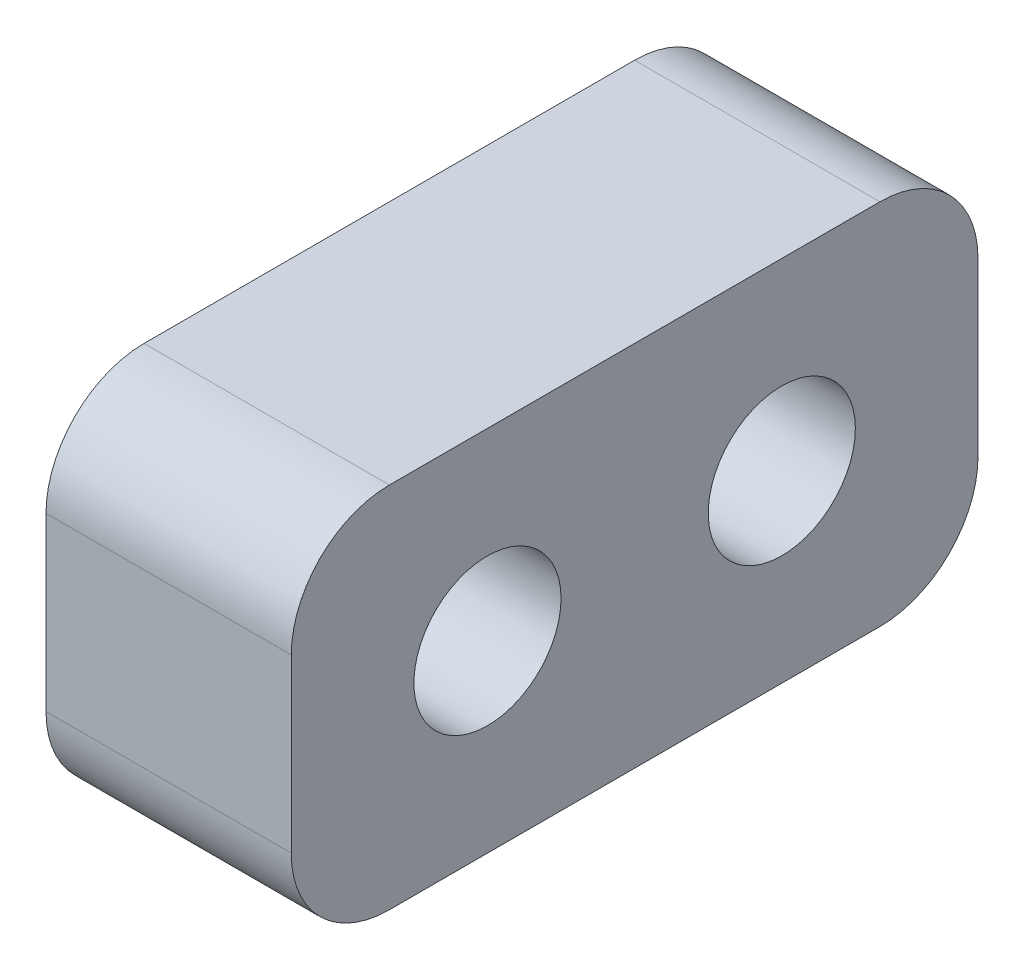
ISO-10303-21;
HEADER;
FILE_DESCRIPTION(('STEP AP214'),'2;1');
FILE_NAME('part.step','',(''),(''),'','','');
FILE_SCHEMA(('AUTOMOTIVE_DESIGN { 1 0 10303 214 1 1 1 1 }'));
ENDSEC;
DATA;
#1=APPLICATION_CONTEXT('core data for automotive mechanical design processes');
#2=APPLICATION_PROTOCOL_DEFINITION('international standard','automotive_design',2000,#1);
#3=PRODUCT_CONTEXT('',#1,'mechanical');
#4=PRODUCT('Part','Part','',(#3));
#5=PRODUCT_RELATED_PRODUCT_CATEGORY('part','',(#4));
#6=PRODUCT_DEFINITION_FORMATION('','',#4);
#7=PRODUCT_DEFINITION_CONTEXT('part definition',#1,'design');
#8=PRODUCT_DEFINITION('design','',#6,#7);
#9=PRODUCT_DEFINITION_SHAPE('','',#8);
#10=(LENGTH_UNIT() NAMED_UNIT(*) SI_UNIT(.MILLI.,.METRE.));
#11=(NAMED_UNIT(*) PLANE_ANGLE_UNIT() SI_UNIT($,.RADIAN.));
#12=(NAMED_UNIT(*) SI_UNIT($,.STERADIAN.) SOLID_ANGLE_UNIT());
#13=UNCERTAINTY_MEASURE_WITH_UNIT(LENGTH_MEASURE(1.E-05),#10,'distance_accuracy_value','');
#14=(GEOMETRIC_REPRESENTATION_CONTEXT(3) GLOBAL_UNCERTAINTY_ASSIGNED_CONTEXT((#13)) GLOBAL_UNIT_ASSIGNED_CONTEXT((#10,
#11,#12)) REPRESENTATION_CONTEXT('',''));
#15=CARTESIAN_POINT('',(0.,0.,0.));
#16=DIRECTION('',(0.,0.,1.));
#17=DIRECTION('',(1.,0.,0.));
#18=AXIS2_PLACEMENT_3D('',#15,#16,#17);
#19=CARTESIAN_POINT('',(5.,5.5,12.));
#20=DIRECTION('',(1.,0.,0.));
#21=DIRECTION('',(0.,0.,-1.));
#22=AXIS2_PLACEMENT_3D('',#19,#20,#21);
#23=PLANE('',#22);
#24=CARTESIAN_POINT('',(5.,3.75,10.));
#25=DIRECTION('',(1.,0.,0.));
#26=DIRECTION('',(0.,0.,-1.));
#27=AXIS2_PLACEMENT_3D('',#24,#25,#26);
#28=CIRCLE('',#27,1.5);
#29=CARTESIAN_POINT('',(5.,3.75,8.5));
#30=VERTEX_POINT('',#29);
#31=EDGE_CURVE('E140',#30,#30,#28,.T.);
#32=ORIENTED_EDGE('',*,*,#31,.F.);
#33=EDGE_LOOP('',(#32));
#34=FACE_BOUND('',#33,.T.);
#35=CARTESIAN_POINT('',(5.,5.5,12.));
#36=DIRECTION('',(1.,0.,0.));
#37=DIRECTION('',(0.,0.,-1.));
#38=AXIS2_PLACEMENT_3D('',#35,#36,#37);
#39=CIRCLE('',#38,2.);
#40=CARTESIAN_POINT('',(5.,7.5,12.));
#41=VERTEX_POINT('',#40);
#42=CARTESIAN_POINT('',(5.,5.5,14.));
#43=VERTEX_POINT('',#42);
#44=EDGE_CURVE('E151',#41,#43,#39,.T.);
#45=ORIENTED_EDGE('',*,*,#44,.T.);
#46=DIRECTION('',(0.,-1.,0.));
#47=VECTOR('',#46,1.);
#48=CARTESIAN_POINT('',(5.,2.,14.));
#49=LINE('',#48,#47);
#50=CARTESIAN_POINT('',(5.,2.,14.));
#51=VERTEX_POINT('',#50);
#52=EDGE_CURVE('E99',#43,#51,#49,.T.);
#53=ORIENTED_EDGE('',*,*,#52,.T.);
#54=CARTESIAN_POINT('',(5.,2.,12.));
#55=DIRECTION('',(1.,0.,0.));
#56=DIRECTION('',(0.,0.,1.));
#57=AXIS2_PLACEMENT_3D('',#54,#55,#56);
#58=CIRCLE('',#57,2.);
#59=CARTESIAN_POINT('',(5.,0.,12.));
#60=VERTEX_POINT('',#59);
#61=EDGE_CURVE('E166',#51,#60,#58,.T.);
#62=ORIENTED_EDGE('',*,*,#61,.T.);
#63=DIRECTION('',(0.,0.,-1.));
#64=VECTOR('',#63,1.);
#65=CARTESIAN_POINT('',(5.,0.,2.00000000000001));
#66=LINE('',#65,#64);
#67=CARTESIAN_POINT('',(5.,0.,2.00000000000001));
#68=VERTEX_POINT('',#67);
#69=EDGE_CURVE('E179',#60,#68,#66,.T.);
#70=ORIENTED_EDGE('',*,*,#69,.T.);
#71=CARTESIAN_POINT('',(5.,2.,2.));
#72=DIRECTION('',(1.,0.,0.));
#73=DIRECTION('',(0.,0.,-1.));
#74=AXIS2_PLACEMENT_3D('',#71,#72,#73);
#75=CIRCLE('',#74,2.);
#76=CARTESIAN_POINT('',(5.,2.00000000000001,0.));
#77=VERTEX_POINT('',#76);
#78=EDGE_CURVE('E118',#68,#77,#75,.T.);
#79=ORIENTED_EDGE('',*,*,#78,.T.);
#80=DIRECTION('',(0.,1.,0.));
#81=VECTOR('',#80,1.);
#82=CARTESIAN_POINT('',(5.,5.5,0.));
#83=LINE('',#82,#81);
#84=CARTESIAN_POINT('',(5.,5.5,0.));
#85=VERTEX_POINT('',#84);
#86=EDGE_CURVE('E112',#77,#85,#83,.T.);
#87=ORIENTED_EDGE('',*,*,#86,.T.);
#88=CARTESIAN_POINT('',(5.,5.5,2.));
#89=DIRECTION('',(1.,0.,0.));
#90=DIRECTION('',(0.,0.,1.));
#91=AXIS2_PLACEMENT_3D('',#88,#89,#90);
#92=CIRCLE('',#91,2.);
#93=CARTESIAN_POINT('',(5.,7.5,2.));
#94=VERTEX_POINT('',#93);
#95=EDGE_CURVE('E116',#85,#94,#92,.T.);
#96=ORIENTED_EDGE('',*,*,#95,.T.);
#97=DIRECTION('',(0.,0.,1.));
#98=VECTOR('',#97,1.);
#99=CARTESIAN_POINT('',(5.,7.5,12.));
#100=LINE('',#99,#98);
#101=EDGE_CURVE('E56',#94,#41,#100,.T.);
#102=ORIENTED_EDGE('',*,*,#101,.T.);
#103=EDGE_LOOP('',(#45,#53,#62,#70,#79,#87,#96,#102));
#104=FACE_BOUND('',#103,.T.);
#105=CARTESIAN_POINT('',(5.,3.75,4.));
#106=DIRECTION('',(1.,0.,0.));
#107=DIRECTION('',(0.,0.,-1.));
#108=AXIS2_PLACEMENT_3D('',#105,#106,#107);
#109=CIRCLE('',#108,1.5);
#110=CARTESIAN_POINT('',(5.,3.75,2.5));
#111=VERTEX_POINT('',#110);
#112=EDGE_CURVE('E188',#111,#111,#109,.T.);
#113=ORIENTED_EDGE('',*,*,#112,.F.);
#114=EDGE_LOOP('',(#113));
#115=FACE_BOUND('',#114,.T.);
#116=ADVANCED_FACE('F39',(#34,#104,#115),#23,.T.);
#117=CARTESIAN_POINT('',(0.,5.5,12.));
#118=DIRECTION('',(1.,0.,0.));
#119=DIRECTION('',(0.,0.,-1.));
#120=AXIS2_PLACEMENT_3D('',#117,#118,#119);
#121=PLANE('',#120);
#122=CARTESIAN_POINT('',(0.,5.5,12.));
#123=DIRECTION('',(1.,0.,0.));
#124=DIRECTION('',(0.,0.,-1.));
#125=AXIS2_PLACEMENT_3D('',#122,#123,#124);
#126=CIRCLE('',#125,2.);
#127=CARTESIAN_POINT('',(0.,7.5,12.));
#128=VERTEX_POINT('',#127);
#129=CARTESIAN_POINT('',(0.,5.5,14.));
#130=VERTEX_POINT('',#129);
#131=EDGE_CURVE('E136',#128,#130,#126,.T.);
#132=ORIENTED_EDGE('',*,*,#131,.F.);
#133=DIRECTION('',(0.,0.,1.));
#134=VECTOR('',#133,1.);
#135=CARTESIAN_POINT('',(0.,7.5,12.));
#136=LINE('',#135,#134);
#137=CARTESIAN_POINT('',(0.,7.5,2.));
#138=VERTEX_POINT('',#137);
#139=EDGE_CURVE('E91',#138,#128,#136,.T.);
#140=ORIENTED_EDGE('',*,*,#139,.F.);
#141=CARTESIAN_POINT('',(0.,5.5,2.));
#142=DIRECTION('',(1.,0.,0.));
#143=DIRECTION('',(0.,0.,1.));
#144=AXIS2_PLACEMENT_3D('',#141,#142,#143);
#145=CIRCLE('',#144,2.);
#146=CARTESIAN_POINT('',(0.,5.5,0.));
#147=VERTEX_POINT('',#146);
#148=EDGE_CURVE('E85',#147,#138,#145,.T.);
#149=ORIENTED_EDGE('',*,*,#148,.F.);
#150=DIRECTION('',(0.,1.,0.));
#151=VECTOR('',#150,1.);
#152=CARTESIAN_POINT('',(0.,5.5,0.));
#153=LINE('',#152,#151);
#154=CARTESIAN_POINT('',(0.,2.00000000000001,0.));
#155=VERTEX_POINT('',#154);
#156=EDGE_CURVE('E126',#155,#147,#153,.T.);
#157=ORIENTED_EDGE('',*,*,#156,.F.);
#158=CARTESIAN_POINT('',(0.,2.,2.));
#159=DIRECTION('',(1.,0.,0.));
#160=DIRECTION('',(0.,0.,-1.));
#161=AXIS2_PLACEMENT_3D('',#158,#159,#160);
#162=CIRCLE('',#161,2.);
#163=CARTESIAN_POINT('',(0.,0.,2.00000000000001));
#164=VERTEX_POINT('',#163);
#165=EDGE_CURVE('E146',#164,#155,#162,.T.);
#166=ORIENTED_EDGE('',*,*,#165,.F.);
#167=DIRECTION('',(0.,0.,-1.));
#168=VECTOR('',#167,1.);
#169=CARTESIAN_POINT('',(0.,0.,2.00000000000001));
#170=LINE('',#169,#168);
#171=CARTESIAN_POINT('',(0.,0.,12.));
#172=VERTEX_POINT('',#171);
#173=EDGE_CURVE('E144',#172,#164,#170,.T.);
#174=ORIENTED_EDGE('',*,*,#173,.F.);
#175=CARTESIAN_POINT('',(0.,2.,12.));
#176=DIRECTION('',(1.,0.,0.));
#177=DIRECTION('',(0.,0.,1.));
#178=AXIS2_PLACEMENT_3D('',#175,#176,#177);
#179=CIRCLE('',#178,2.);
#180=CARTESIAN_POINT('',(0.,2.,14.));
#181=VERTEX_POINT('',#180);
#182=EDGE_CURVE('E142',#181,#172,#179,.T.);
#183=ORIENTED_EDGE('',*,*,#182,.F.);
#184=DIRECTION('',(0.,-1.,0.));
#185=VECTOR('',#184,1.);
#186=CARTESIAN_POINT('',(0.,2.,14.));
#187=LINE('',#186,#185);
#188=EDGE_CURVE('E139',#130,#181,#187,.T.);
#189=ORIENTED_EDGE('',*,*,#188,.F.);
#190=EDGE_LOOP('',(#132,#140,#149,#157,#166,#174,#183,#189));
#191=FACE_BOUND('',#190,.T.);
#192=CARTESIAN_POINT('',(0.,3.75,10.));
#193=DIRECTION('',(1.,0.,0.));
#194=DIRECTION('',(0.,0.,-1.));
#195=AXIS2_PLACEMENT_3D('',#192,#193,#194);
#196=CIRCLE('',#195,1.5);
#197=CARTESIAN_POINT('',(0.,3.75,8.5));
#198=VERTEX_POINT('',#197);
#199=EDGE_CURVE('E185',#198,#198,#196,.T.);
#200=ORIENTED_EDGE('',*,*,#199,.T.);
#201=EDGE_LOOP('',(#200));
#202=FACE_BOUND('',#201,.T.);
#203=CARTESIAN_POINT('',(0.,3.75,4.));
#204=DIRECTION('',(1.,0.,0.));
#205=DIRECTION('',(0.,0.,-1.));
#206=AXIS2_PLACEMENT_3D('',#203,#204,#205);
#207=CIRCLE('',#206,1.5);
#208=CARTESIAN_POINT('',(0.,3.75,2.5));
#209=VERTEX_POINT('',#208);
#210=EDGE_CURVE('E191',#209,#209,#207,.T.);
#211=ORIENTED_EDGE('',*,*,#210,.T.);
#212=EDGE_LOOP('',(#211));
#213=FACE_BOUND('',#212,.T.);
#214=ADVANCED_FACE('F170',(#191,#202,#213),#121,.F.);
#215=CARTESIAN_POINT('',(5.,5.5,12.));
#216=DIRECTION('',(-1.,0.,0.));
#217=DIRECTION('',(0.,0.,1.));
#218=AXIS2_PLACEMENT_3D('',#215,#216,#217);
#219=CYLINDRICAL_SURFACE('',#218,2.);
#220=ORIENTED_EDGE('',*,*,#131,.T.);
#221=DIRECTION('',(-1.,0.,0.));
#222=VECTOR('',#221,1.);
#223=CARTESIAN_POINT('',(5.,5.5,14.));
#224=LINE('',#223,#222);
#225=EDGE_CURVE('E11',#43,#130,#224,.T.);
#226=ORIENTED_EDGE('',*,*,#225,.F.);
#227=ORIENTED_EDGE('',*,*,#44,.F.);
#228=DIRECTION('',(-1.,0.,0.));
#229=VECTOR('',#228,1.);
#230=CARTESIAN_POINT('',(5.,7.5,12.));
#231=LINE('',#230,#229);
#232=EDGE_CURVE('E132',#41,#128,#231,.T.);
#233=ORIENTED_EDGE('',*,*,#232,.T.);
#234=EDGE_LOOP('',(#220,#226,#227,#233));
#235=FACE_BOUND('',#234,.T.);
#236=ADVANCED_FACE('F41',(#235),#219,.T.);
#237=CARTESIAN_POINT('',(5.,2.,14.));
#238=DIRECTION('',(0.,0.,-1.));
#239=DIRECTION('',(0.,1.,0.));
#240=AXIS2_PLACEMENT_3D('',#237,#238,#239);
#241=PLANE('',#240);
#242=ORIENTED_EDGE('',*,*,#188,.T.);
#243=DIRECTION('',(-1.,0.,0.));
#244=VECTOR('',#243,1.);
#245=CARTESIAN_POINT('',(5.,2.,14.));
#246=LINE('',#245,#244);
#247=EDGE_CURVE('E48',#51,#181,#246,.T.);
#248=ORIENTED_EDGE('',*,*,#247,.F.);
#249=ORIENTED_EDGE('',*,*,#52,.F.);
#250=ORIENTED_EDGE('',*,*,#225,.T.);
#251=EDGE_LOOP('',(#242,#248,#249,#250));
#252=FACE_BOUND('',#251,.T.);
#253=ADVANCED_FACE('F223',(#252),#241,.F.);
#254=CARTESIAN_POINT('',(5.,2.,12.));
#255=DIRECTION('',(-1.,0.,0.));
#256=DIRECTION('',(0.,0.,1.));
#257=AXIS2_PLACEMENT_3D('',#254,#255,#256);
#258=CYLINDRICAL_SURFACE('',#257,2.);
#259=ORIENTED_EDGE('',*,*,#182,.T.);
#260=DIRECTION('',(-1.,0.,0.));
#261=VECTOR('',#260,1.);
#262=CARTESIAN_POINT('',(5.,0.,12.));
#263=LINE('',#262,#261);
#264=EDGE_CURVE('E158',#60,#172,#263,.T.);
#265=ORIENTED_EDGE('',*,*,#264,.F.);
#266=ORIENTED_EDGE('',*,*,#61,.F.);
#267=ORIENTED_EDGE('',*,*,#247,.T.);
#268=EDGE_LOOP('',(#259,#265,#266,#267));
#269=FACE_BOUND('',#268,.T.);
#270=ADVANCED_FACE('F164',(#269),#258,.T.);
#271=CARTESIAN_POINT('',(5.,0.,2.00000000000001));
#272=DIRECTION('',(0.,1.,0.));
#273=DIRECTION('',(0.,0.,1.));
#274=AXIS2_PLACEMENT_3D('',#271,#272,#273);
#275=PLANE('',#274);
#276=ORIENTED_EDGE('',*,*,#173,.T.);
#277=DIRECTION('',(-1.,0.,0.));
#278=VECTOR('',#277,1.);
#279=CARTESIAN_POINT('',(5.,0.,2.00000000000001));
#280=LINE('',#279,#278);
#281=EDGE_CURVE('E155',#68,#164,#280,.T.);
#282=ORIENTED_EDGE('',*,*,#281,.F.);
#283=ORIENTED_EDGE('',*,*,#69,.F.);
#284=ORIENTED_EDGE('',*,*,#264,.T.);
#285=EDGE_LOOP('',(#276,#282,#283,#284));
#286=FACE_BOUND('',#285,.T.);
#287=ADVANCED_FACE('F175',(#286),#275,.F.);
#288=CARTESIAN_POINT('',(5.,2.,2.));
#289=DIRECTION('',(-1.,0.,0.));
#290=DIRECTION('',(0.,0.,1.));
#291=AXIS2_PLACEMENT_3D('',#288,#289,#290);
#292=CYLINDRICAL_SURFACE('',#291,2.);
#293=ORIENTED_EDGE('',*,*,#165,.T.);
#294=DIRECTION('',(-1.,0.,0.));
#295=VECTOR('',#294,1.);
#296=CARTESIAN_POINT('',(5.,2.00000000000001,0.));
#297=LINE('',#296,#295);
#298=EDGE_CURVE('E127',#77,#155,#297,.T.);
#299=ORIENTED_EDGE('',*,*,#298,.F.);
#300=ORIENTED_EDGE('',*,*,#78,.F.);
#301=ORIENTED_EDGE('',*,*,#281,.T.);
#302=EDGE_LOOP('',(#293,#299,#300,#301));
#303=FACE_BOUND('',#302,.T.);
#304=ADVANCED_FACE('F178',(#303),#292,.T.);
#305=CARTESIAN_POINT('',(5.,5.5,0.));
#306=DIRECTION('',(0.,0.,1.));
#307=DIRECTION('',(0.,-1.,0.));
#308=AXIS2_PLACEMENT_3D('',#305,#306,#307);
#309=PLANE('',#308);
#310=ORIENTED_EDGE('',*,*,#156,.T.);
#311=DIRECTION('',(-1.,0.,0.));
#312=VECTOR('',#311,1.);
#313=CARTESIAN_POINT('',(5.,5.5,0.));
#314=LINE('',#313,#312);
#315=EDGE_CURVE('E123',#85,#147,#314,.T.);
#316=ORIENTED_EDGE('',*,*,#315,.F.);
#317=ORIENTED_EDGE('',*,*,#86,.F.);
#318=ORIENTED_EDGE('',*,*,#298,.T.);
#319=EDGE_LOOP('',(#310,#316,#317,#318));
#320=FACE_BOUND('',#319,.T.);
#321=ADVANCED_FACE('F124',(#320),#309,.F.);
#322=CARTESIAN_POINT('',(5.,5.5,2.));
#323=DIRECTION('',(-1.,0.,0.));
#324=DIRECTION('',(0.,0.,1.));
#325=AXIS2_PLACEMENT_3D('',#322,#323,#324);
#326=CYLINDRICAL_SURFACE('',#325,2.);
#327=ORIENTED_EDGE('',*,*,#148,.T.);
#328=DIRECTION('',(-1.,0.,0.));
#329=VECTOR('',#328,1.);
#330=CARTESIAN_POINT('',(5.,7.5,2.));
#331=LINE('',#330,#329);
#332=EDGE_CURVE('E128',#94,#138,#331,.T.);
#333=ORIENTED_EDGE('',*,*,#332,.F.);
#334=ORIENTED_EDGE('',*,*,#95,.F.);
#335=ORIENTED_EDGE('',*,*,#315,.T.);
#336=EDGE_LOOP('',(#327,#333,#334,#335));
#337=FACE_BOUND('',#336,.T.);
#338=ADVANCED_FACE('F130',(#337),#326,.T.);
#339=CARTESIAN_POINT('',(5.,7.5,12.));
#340=DIRECTION('',(0.,-1.,0.));
#341=DIRECTION('',(0.,0.,-1.));
#342=AXIS2_PLACEMENT_3D('',#339,#340,#341);
#343=PLANE('',#342);
#344=ORIENTED_EDGE('',*,*,#139,.T.);
#345=ORIENTED_EDGE('',*,*,#232,.F.);
#346=ORIENTED_EDGE('',*,*,#101,.F.);
#347=ORIENTED_EDGE('',*,*,#332,.T.);
#348=EDGE_LOOP('',(#344,#345,#346,#347));
#349=FACE_BOUND('',#348,.T.);
#350=ADVANCED_FACE('F211',(#349),#343,.F.);
#351=CARTESIAN_POINT('',(5.,3.75,10.));
#352=DIRECTION('',(-1.,0.,0.));
#353=DIRECTION('',(0.,0.,1.));
#354=AXIS2_PLACEMENT_3D('',#351,#352,#353);
#355=CYLINDRICAL_SURFACE('',#354,1.5);
#356=ORIENTED_EDGE('',*,*,#31,.T.);
#357=EDGE_LOOP('',(#356));
#358=FACE_BOUND('',#357,.T.);
#359=ORIENTED_EDGE('',*,*,#199,.F.);
#360=EDGE_LOOP('',(#359));
#361=FACE_BOUND('',#360,.T.);
#362=ADVANCED_FACE('F208',(#358,#361),#355,.F.);
#363=CARTESIAN_POINT('',(5.,3.75,4.));
#364=DIRECTION('',(-1.,0.,0.));
#365=DIRECTION('',(0.,0.,1.));
#366=AXIS2_PLACEMENT_3D('',#363,#364,#365);
#367=CYLINDRICAL_SURFACE('',#366,1.5);
#368=ORIENTED_EDGE('',*,*,#112,.T.);
#369=EDGE_LOOP('',(#368));
#370=FACE_BOUND('',#369,.T.);
#371=ORIENTED_EDGE('',*,*,#210,.F.);
#372=EDGE_LOOP('',(#371));
#373=FACE_BOUND('',#372,.T.);
#374=ADVANCED_FACE('F197',(#370,#373),#367,.F.);
#375=CLOSED_SHELL('',(#116,#214,#236,#253,#270,#287,#304,#321,#338,#350,#362,#374));
#376=MANIFOLD_SOLID_BREP('B2',#375);
#377=ADVANCED_BREP_SHAPE_REPRESENTATION('',(#18,#376),#14);
#378=SHAPE_DEFINITION_REPRESENTATION(#9,#377);
ENDSEC;
END-ISO-10303-21;
